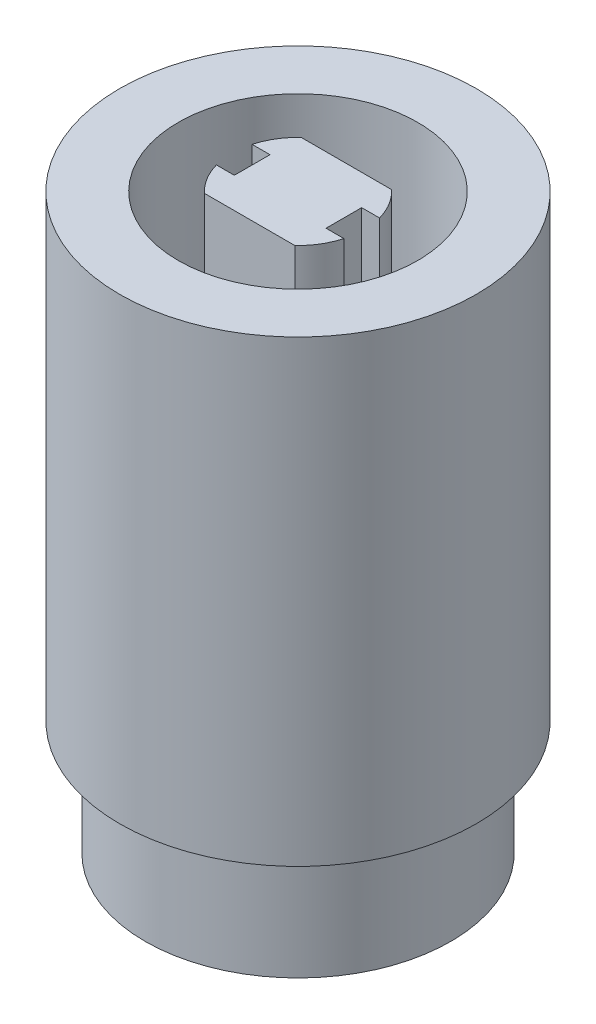
ISO-10303-21;
HEADER;
FILE_DESCRIPTION(('STEP AP214'),'2;1');
FILE_NAME('part.step','',(''),(''),'','','');
FILE_SCHEMA(('AUTOMOTIVE_DESIGN { 1 0 10303 214 1 1 1 1 }'));
ENDSEC;
DATA;
#1=APPLICATION_CONTEXT('core data for automotive mechanical design processes');
#2=APPLICATION_PROTOCOL_DEFINITION('international standard','automotive_design',2000,#1);
#3=PRODUCT_CONTEXT('',#1,'mechanical');
#4=PRODUCT('Part','Part','',(#3));
#5=PRODUCT_RELATED_PRODUCT_CATEGORY('part','',(#4));
#6=PRODUCT_DEFINITION_FORMATION('','',#4);
#7=PRODUCT_DEFINITION_CONTEXT('part definition',#1,'design');
#8=PRODUCT_DEFINITION('design','',#6,#7);
#9=PRODUCT_DEFINITION_SHAPE('','',#8);
#10=(LENGTH_UNIT() NAMED_UNIT(*) SI_UNIT(.MILLI.,.METRE.));
#11=(NAMED_UNIT(*) PLANE_ANGLE_UNIT() SI_UNIT($,.RADIAN.));
#12=(NAMED_UNIT(*) SI_UNIT($,.STERADIAN.) SOLID_ANGLE_UNIT());
#13=UNCERTAINTY_MEASURE_WITH_UNIT(LENGTH_MEASURE(1.E-05),#10,'distance_accuracy_value','');
#14=(GEOMETRIC_REPRESENTATION_CONTEXT(3) GLOBAL_UNCERTAINTY_ASSIGNED_CONTEXT((#13)) GLOBAL_UNIT_ASSIGNED_CONTEXT((#10,
#11,#12)) REPRESENTATION_CONTEXT('',''));
#15=CARTESIAN_POINT('',(0.,0.,0.));
#16=DIRECTION('',(0.,0.,1.));
#17=DIRECTION('',(1.,0.,0.));
#18=AXIS2_PLACEMENT_3D('',#15,#16,#17);
#19=CARTESIAN_POINT('',(0.,16.5,0.));
#20=DIRECTION('',(0.,-1.,0.));
#21=DIRECTION('',(0.,0.,-1.));
#22=AXIS2_PLACEMENT_3D('',#19,#20,#21);
#23=CYLINDRICAL_SURFACE('',#22,6.);
#24=CARTESIAN_POINT('',(0.,0.,0.));
#25=DIRECTION('',(0.,1.,0.));
#26=DIRECTION('',(0.,0.,1.));
#27=AXIS2_PLACEMENT_3D('',#24,#25,#26);
#28=CIRCLE('',#27,6.);
#29=CARTESIAN_POINT('',(0.,0.,6.));
#30=VERTEX_POINT('',#29);
#31=EDGE_CURVE('E215',#30,#30,#28,.T.);
#32=ORIENTED_EDGE('',*,*,#31,.T.);
#33=EDGE_LOOP('',(#32));
#34=FACE_BOUND('',#33,.T.);
#35=CARTESIAN_POINT('',(0.,4.5,0.));
#36=DIRECTION('',(0.,1.,0.));
#37=DIRECTION('',(0.,0.,1.));
#38=AXIS2_PLACEMENT_3D('',#35,#36,#37);
#39=CIRCLE('',#38,6.);
#40=CARTESIAN_POINT('',(0.,4.5,6.));
#41=VERTEX_POINT('',#40);
#42=EDGE_CURVE('E11',#41,#41,#39,.T.);
#43=ORIENTED_EDGE('',*,*,#42,.F.);
#44=EDGE_LOOP('',(#43));
#45=FACE_BOUND('',#44,.T.);
#46=ADVANCED_FACE('F35',(#34,#45),#23,.T.);
#47=CARTESIAN_POINT('',(0.,0.,0.));
#48=DIRECTION('',(0.,1.,0.));
#49=DIRECTION('',(0.,0.,1.));
#50=AXIS2_PLACEMENT_3D('',#47,#48,#49);
#51=PLANE('',#50);
#52=CARTESIAN_POINT('',(0.,0.,0.));
#53=DIRECTION('',(0.,-1.,0.));
#54=DIRECTION('',(0.,0.,-1.));
#55=AXIS2_PLACEMENT_3D('',#52,#53,#54);
#56=CIRCLE('',#55,4.2);
#57=CARTESIAN_POINT('',(0.,0.,-4.2));
#58=VERTEX_POINT('',#57);
#59=EDGE_CURVE('E204',#58,#58,#56,.T.);
#60=ORIENTED_EDGE('',*,*,#59,.F.);
#61=EDGE_LOOP('',(#60));
#62=FACE_BOUND('',#61,.T.);
#63=ORIENTED_EDGE('',*,*,#31,.F.);
#64=EDGE_LOOP('',(#63));
#65=FACE_BOUND('',#64,.T.);
#66=ADVANCED_FACE('F278',(#62,#65),#51,.F.);
#67=CARTESIAN_POINT('',(0.,14.5,0.));
#68=DIRECTION('',(0.,-1.,0.));
#69=DIRECTION('',(0.,0.,-1.));
#70=AXIS2_PLACEMENT_3D('',#67,#68,#69);
#71=CYLINDRICAL_SURFACE('',#70,4.2);
#72=CARTESIAN_POINT('',(1.4,10.,-3.95979797464467));
#73=CARTESIAN_POINT('',(1.4000003611268,10.0762554447705,-3.95979772342607));
#74=CARTESIAN_POINT('',(1.39374869715973,10.152508719753,-3.962024770072));
#75=CARTESIAN_POINT('',(1.36899158436433,10.3027561893919,-3.97064603713757));
#76=CARTESIAN_POINT('',(1.35048411703576,10.3767500098215,-3.97704094399064));
#77=CARTESIAN_POINT('',(1.30193767995887,10.5202776501962,-3.99319485164308));
#78=CARTESIAN_POINT('',(1.27192130996454,10.5898199012198,-4.00294725559851));
#79=CARTESIAN_POINT('',(1.20128627981793,10.7229040679671,-4.02470770814455));
#80=CARTESIAN_POINT('',(1.16066528040426,10.7864446555751,-4.03671625425057));
#81=CARTESIAN_POINT('',(1.06827160502003,10.9082079472736,-4.06216285170462));
#82=CARTESIAN_POINT('',(1.01615407792909,10.9661616001404,-4.07563652782502));
#83=CARTESIAN_POINT('',(0.902982734100153,11.0726895217145,-4.10219410721404));
#84=CARTESIAN_POINT('',(0.841927485073326,11.1212622842153,-4.11527794760546));
#85=CARTESIAN_POINT('',(0.710646311151014,11.2088704562614,-4.13999413690519));
#86=CARTESIAN_POINT('',(0.640222675714335,11.2476239588651,-4.15157970782248));
#87=CARTESIAN_POINT('',(0.493403712182463,11.3126282191785,-4.17157421479376));
#88=CARTESIAN_POINT('',(0.417009999962097,11.3388823464477,-4.17998400684202));
#89=CARTESIAN_POINT('',(0.263240344406891,11.3772301964853,-4.1924270560467));
#90=CARTESIAN_POINT('',(0.185991056794154,11.3897848247598,-4.19660240688585));
#91=CARTESIAN_POINT('',(0.0303770247537259,11.4018428107049,-4.20061051505545));
#92=CARTESIAN_POINT('',(-0.0479874269614512,11.4013495323134,-4.20044439168047));
#93=CARTESIAN_POINT('',(-0.200344921271345,11.3876180436076,-4.19588455466231));
#94=CARTESIAN_POINT('',(-0.274388868028335,11.3748804601357,-4.19165690657189));
#95=CARTESIAN_POINT('',(-0.419220814351026,11.3378498266274,-4.17965754275599));
#96=CARTESIAN_POINT('',(-0.490008592890846,11.3135559934283,-4.17188558683561));
#97=CARTESIAN_POINT('',(-0.627413464778819,11.2538101557714,-4.15345938410609));
#98=CARTESIAN_POINT('',(-0.693963509356598,11.2182156860345,-4.14276859533977));
#99=CARTESIAN_POINT('',(-0.820294055738037,11.1369964123723,-4.11961750254131));
#100=CARTESIAN_POINT('',(-0.880072668138678,11.0913688193427,-4.10715670680725));
#101=CARTESIAN_POINT('',(-0.994141213172669,10.988855849155,-4.08108668591246));
#102=CARTESIAN_POINT('',(-1.04804021989458,10.9315415790164,-4.06745101241733));
#103=CARTESIAN_POINT('',(-1.14558816343425,10.8085717839883,-4.04106269343156));
#104=CARTESIAN_POINT('',(-1.18923552058221,10.7429149760015,-4.0283101842403));
#105=CARTESIAN_POINT('',(-1.26558243705982,10.6038849241384,-4.00498735189743));
#106=CARTESIAN_POINT('',(-1.29811704911147,10.5304150160851,-3.9944507307435));
#107=CARTESIAN_POINT('',(-1.35022047061931,10.3786000480272,-3.97714311229618));
#108=CARTESIAN_POINT('',(-1.36979471405774,10.3002570462894,-3.97037053701712));
#109=CARTESIAN_POINT('',(-1.39462579492666,10.1447063024391,-3.96171490822898));
#110=CARTESIAN_POINT('',(-1.40048873370805,10.067606805356,-3.95962504441195));
#111=CARTESIAN_POINT('',(-1.39944761447625,9.91351339123615,-3.95999340887921));
#112=CARTESIAN_POINT('',(-1.39254587531816,9.83651945756533,-3.96245081109875));
#113=CARTESIAN_POINT('',(-1.36671591217256,9.68758024800437,-3.9714306532513));
#114=CARTESIAN_POINT('',(-1.34820895157278,9.61555239778911,-3.97781055616831));
#115=CARTESIAN_POINT('',(-1.30019940758483,9.47563895126486,-3.99375975139778));
#116=CARTESIAN_POINT('',(-1.27069487490884,9.40775409177284,-4.00332960908869));
#117=CARTESIAN_POINT('',(-1.20046407703446,9.27566741081428,-4.02495628634005));
#118=CARTESIAN_POINT('',(-1.15941156570188,9.2116507003015,-4.03708235931854));
#119=CARTESIAN_POINT('',(-1.0676198827806,9.09119552666277,-4.06232076223377));
#120=CARTESIAN_POINT('',(-1.0168778556983,9.03475930587429,-4.07543338221319));
#121=CARTESIAN_POINT('',(-0.904248388260451,8.92826082227311,-4.10193054092981));
#122=CARTESIAN_POINT('',(-0.841942178765312,8.87863585397361,-4.11529781009053));
#123=CARTESIAN_POINT('',(-0.70955820796036,8.79051740071274,-4.14017592258354));
#124=CARTESIAN_POINT('',(-0.639480722810373,8.7520235203726,-4.15168683184773));
#125=CARTESIAN_POINT('',(-0.493891807405213,8.6876118531936,-4.17150168134844));
#126=CARTESIAN_POINT('',(-0.418419572649675,8.66161221199271,-4.17982642006343));
#127=CARTESIAN_POINT('',(-0.263841852184423,8.62278116111585,-4.19242055172885));
#128=CARTESIAN_POINT('',(-0.184737688735445,8.6099449981673,-4.19669140847626));
#129=CARTESIAN_POINT('',(-0.0291414702040569,8.5982330913521,-4.20058608530759));
#130=CARTESIAN_POINT('',(0.0472986134880263,8.59872956449467,-4.20041888125215));
#131=CARTESIAN_POINT('',(0.198955603000244,8.61212023140497,-4.19597075127157));
#132=CARTESIAN_POINT('',(0.27417260754668,8.62501341941388,-4.19169015907006));
#133=CARTESIAN_POINT('',(0.420058967204883,8.66241512840635,-4.17957280936177));
#134=CARTESIAN_POINT('',(0.490781579277905,8.68673590149411,-4.17179361705608));
#135=CARTESIAN_POINT('',(0.627169691315714,8.74612854353602,-4.15348024986293));
#136=CARTESIAN_POINT('',(0.692834273799405,8.78120235727582,-4.14294557667223));
#137=CARTESIAN_POINT('',(0.819887622832299,8.86259731694281,-4.11972216359033));
#138=CARTESIAN_POINT('',(0.881028752180648,8.9092861595343,-4.10696821488697));
#139=CARTESIAN_POINT('',(0.994813436781397,9.01196034761867,-4.08090184308631));
#140=CARTESIAN_POINT('',(1.04745427027443,9.06794865916782,-4.06758924282336));
#141=CARTESIAN_POINT('',(1.14483853236637,9.19025309782173,-4.04128591755837));
#142=CARTESIAN_POINT('',(1.18919215239706,9.2568877153673,-4.02832819184083));
#143=CARTESIAN_POINT('',(1.26604008062156,9.39706819766389,-4.00484270652221));
#144=CARTESIAN_POINT('',(1.29853748754726,9.47061225024153,-3.99431431225749));
#145=CARTESIAN_POINT('',(1.34938135948583,9.61914655362188,-3.97741867889121));
#146=CARTESIAN_POINT('',(1.36830107280933,9.69392116893551,-3.97088486000055));
#147=CARTESIAN_POINT('',(1.39360804820897,9.84579847065338,-3.96207536955326));
#148=CARTESIAN_POINT('',(1.39999963487523,9.92290034437499,-3.95979822864446));
#149=CARTESIAN_POINT('',(1.4,10.,-3.95979797464467));
#150=B_SPLINE_CURVE_WITH_KNOTS('',3,(#72,#73,#74,#75,#76,#77,#78,#79,#80,#81,#82,#83,#84,#85,
#86,#87,#88,#89,#90,#91,#92,#93,#94,#95,#96,#97,#98,#99,#100,#101,#102,#103,#104,#105,#106,#107,
#108,#109,#110,#111,#112,#113,#114,#115,#116,#117,#118,#119,#120,#121,#122,#123,#124,#125,#126,
#127,#128,#129,#130,#131,#132,#133,#134,#135,#136,#137,#138,#139,#140,#141,#142,#143,#144,#145,
#146,#147,#148,#149),.UNSPECIFIED.,.T.,.F.,(4,2,2,2,2,2,2,2,2,2,2,2,2,2,2,2,2,2,2,2,2,2,2,2,2,2,
2,2,2,2,2,2,2,2,2,2,2,2,4),(0.,0.2284808187191,0.456999277021229,0.685071278501161,
0.913193632659619,1.14941872398595,1.38568171240783,1.6281090860112,1.87047106941505,
2.10440046270908,2.33826954623258,2.56296606755797,2.78767781864931,3.01534316804469,
3.24307188623631,3.48152244109484,3.72000971456948,3.96189695778806,4.20368271896043,
4.43456007906997,4.66539550168909,4.88830154073068,5.11124710802505,5.34126400826782,
5.5713487992376,5.81250331436311,6.05364926257327,6.29319307663974,6.53265036202601,
6.76085318545471,6.98903749610475,7.21359738453383,7.43819791065321,7.67109727325668,
7.90407106202465,8.14616463827384,8.38819489570395,8.61928497024548,8.8502952606343),.UNSPECIFIED.);
#151=CARTESIAN_POINT('',(1.4,10.,-3.95979797464467));
#152=VERTEX_POINT('',#151);
#153=EDGE_CURVE('E346',#152,#152,#150,.T.);
#154=ORIENTED_EDGE('',*,*,#153,.F.);
#155=EDGE_LOOP('',(#154));
#156=FACE_BOUND('',#155,.T.);
#157=CARTESIAN_POINT('',(0.,14.5,0.));
#158=DIRECTION('',(0.,-1.,0.));
#159=DIRECTION('',(0.,0.,-1.));
#160=AXIS2_PLACEMENT_3D('',#157,#158,#159);
#161=CIRCLE('',#160,4.2);
#162=CARTESIAN_POINT('',(0.,14.5,-4.2));
#163=VERTEX_POINT('',#162);
#164=EDGE_CURVE('E212',#163,#163,#161,.T.);
#165=ORIENTED_EDGE('',*,*,#164,.F.);
#166=EDGE_LOOP('',(#165));
#167=FACE_BOUND('',#166,.T.);
#168=ORIENTED_EDGE('',*,*,#59,.T.);
#169=EDGE_LOOP('',(#168));
#170=FACE_BOUND('',#169,.T.);
#171=ADVANCED_FACE('F283',(#156,#167,#170),#71,.F.);
#172=CARTESIAN_POINT('',(0.,14.5,0.));
#173=DIRECTION('',(0.,-1.,0.));
#174=DIRECTION('',(0.,0.,-1.));
#175=AXIS2_PLACEMENT_3D('',#172,#173,#174);
#176=PLANE('',#175);
#177=ORIENTED_EDGE('',*,*,#164,.T.);
#178=EDGE_LOOP('',(#177));
#179=FACE_BOUND('',#178,.T.);
#180=ADVANCED_FACE('F302',(#179),#176,.T.);
#181=CARTESIAN_POINT('',(0.,4.5,0.));
#182=DIRECTION('',(0.,1.,0.));
#183=DIRECTION('',(0.,0.,1.));
#184=AXIS2_PLACEMENT_3D('',#181,#182,#183);
#185=CYLINDRICAL_SURFACE('',#184,7.);
#186=CARTESIAN_POINT('',(1.4,10.,-6.8585712797929));
#187=CARTESIAN_POINT('',(1.39999712422486,10.0777901256867,-6.85857282635793));
#188=CARTESIAN_POINT('',(1.39349444040526,10.1556164726664,-6.85990911575777));
#189=CARTESIAN_POINT('',(1.36767719701612,10.3090675072006,-6.8651020382723));
#190=CARTESIAN_POINT('',(1.34835238589873,10.3846903824904,-6.86896068802811));
#191=CARTESIAN_POINT('',(1.29751409566761,10.5314922246958,-6.87874423210488));
#192=CARTESIAN_POINT('',(1.26601273981366,10.6026755301456,-6.88466707069477));
#193=CARTESIAN_POINT('',(1.19174875073872,10.7387447825758,-6.89790919272951));
#194=CARTESIAN_POINT('',(1.14898674604161,10.8036310807531,-6.90522839822853));
#195=CARTESIAN_POINT('',(1.05277070591481,10.9261854053954,-6.92055419571946));
#196=CARTESIAN_POINT('',(0.999187918278645,10.9837514230376,-6.92856832972143));
#197=CARTESIAN_POINT('',(0.883129504629835,11.0891405470106,-6.9443146122364));
#198=CARTESIAN_POINT('',(0.820653255769178,11.1369629703841,-6.95204674095165));
#199=CARTESIAN_POINT('',(0.687905898293958,11.2219032246798,-6.96643914984586));
#200=CARTESIAN_POINT('',(0.617571594741094,11.2589241193433,-6.97308950018171));
#201=CARTESIAN_POINT('',(0.471525810542179,11.3205849118674,-6.98448431637084));
#202=CARTESIAN_POINT('',(0.395814833988773,11.3452259686614,-6.98922896061767));
#203=CARTESIAN_POINT('',(0.242223482589891,11.3811100710675,-6.99622448963786));
#204=CARTESIAN_POINT('',(0.164384834900739,11.3925253685994,-6.99850740803378));
#205=CARTESIAN_POINT('',(0.00786599581255045,11.4021713325736,-7.00043289657045));
#206=CARTESIAN_POINT('',(-0.0708141137645805,11.4004032695041,-7.00007572113863));
#207=CARTESIAN_POINT('',(-0.225598801041024,11.3838633476982,-6.99678608815922));
#208=CARTESIAN_POINT('',(-0.301724100017858,11.369277031965,-6.99389037712174));
#209=CARTESIAN_POINT('',(-0.450424277212422,11.3278089545576,-6.98589048023172));
#210=CARTESIAN_POINT('',(-0.522999013245981,11.3009267009314,-6.98078620601655));
#211=CARTESIAN_POINT('',(-0.663067248481243,11.2354579437938,-6.96888214427942));
#212=CARTESIAN_POINT('',(-0.73052584378746,11.1967987484532,-6.96207187445313));
#213=CARTESIAN_POINT('',(-0.858067064203658,11.1089272918688,-6.94750657263299));
#214=CARTESIAN_POINT('',(-0.918148839335001,11.0597138163213,-6.93975143197311));
#215=CARTESIAN_POINT('',(-1.03033200347484,10.9511129290481,-6.92399350110244));
#216=CARTESIAN_POINT('',(-1.08227604320308,10.8915631385786,-6.91598875040523));
#217=CARTESIAN_POINT('',(-1.17546589044753,10.7645169805689,-6.90076200238265));
#218=CARTESIAN_POINT('',(-1.21671149561885,10.6970204627635,-6.89354001986367));
#219=CARTESIAN_POINT('',(-1.28738794072263,10.5557708354495,-6.88069266462093));
#220=CARTESIAN_POINT('',(-1.31679330688879,10.4820046453045,-6.87507074188969));
#221=CARTESIAN_POINT('',(-1.36274647827861,10.3304401467864,-6.86611066849782));
#222=CARTESIAN_POINT('',(-1.3792959592393,10.2526423653333,-6.86277222019799));
#223=CARTESIAN_POINT('',(-1.39883240845047,10.0966491988013,-6.85881670974959));
#224=CARTESIAN_POINT('',(-1.40204660245708,10.0184833959655,-6.85815405880016));
#225=CARTESIAN_POINT('',(-1.39543267963503,9.86273248752044,-6.85950279964396));
#226=CARTESIAN_POINT('',(-1.38560530237142,9.78514734923359,-6.86151403980543));
#227=CARTESIAN_POINT('',(-1.35338309130382,9.63352390359087,-6.86794125492881));
#228=CARTESIAN_POINT('',(-1.33110966917502,9.55945871974993,-6.87233398620296));
#229=CARTESIAN_POINT('',(-1.27475744943192,9.41611140935976,-6.88300885092331));
#230=CARTESIAN_POINT('',(-1.24067767932245,9.34682967738999,-6.88929114000778));
#231=CARTESIAN_POINT('',(-1.16116579910184,9.21402164606977,-6.90313968346855));
#232=CARTESIAN_POINT('',(-1.11559150917586,9.15058213517884,-6.91072160610865));
#233=CARTESIAN_POINT('',(-1.0145738010978,9.03216836319872,-6.92627213357291));
#234=CARTESIAN_POINT('',(-0.959129367202352,8.97719497445105,-6.93424077813345));
#235=CARTESIAN_POINT('',(-0.838925182897047,8.87641241714019,-6.94981484216902));
#236=CARTESIAN_POINT('',(-0.774035498501481,8.83075688349001,-6.95741280792157));
#237=CARTESIAN_POINT('',(-0.637375055288657,8.75099576590058,-6.97125978680068));
#238=CARTESIAN_POINT('',(-0.56560458560691,8.71688969691731,-6.97750885657295));
#239=CARTESIAN_POINT('',(-0.417623753153618,8.66141957955471,-6.98792211685494));
#240=CARTESIAN_POINT('',(-0.341441342869309,8.63998327448325,-6.99209810799646));
#241=CARTESIAN_POINT('',(-0.186465236551877,8.61023225327062,-6.99794530312724));
#242=CARTESIAN_POINT('',(-0.1076718561957,8.60191595673405,-6.99961680879781));
#243=CARTESIAN_POINT('',(0.048822051465073,8.59870222665196,-7.00025956635769));
#244=CARTESIAN_POINT('',(0.126517736998103,8.6035738073613,-6.99927729969091));
#245=CARTESIAN_POINT('',(0.279959443841898,8.62608753076694,-6.99482060984445));
#246=CARTESIAN_POINT('',(0.355705489655168,8.6437295128873,-6.99134621800093));
#247=CARTESIAN_POINT('',(0.502953849643134,8.6911805889283,-6.98229697711));
#248=CARTESIAN_POINT('',(0.574465420536392,8.72096192938366,-6.97672692147075));
#249=CARTESIAN_POINT('',(0.711509708260333,8.79181713786326,-6.96408610972738));
#250=CARTESIAN_POINT('',(0.777041952074376,8.8328918982652,-6.9570152350424));
#251=CARTESIAN_POINT('',(0.901409446148899,8.92594714188692,-6.94200638821005));
#252=CARTESIAN_POINT('',(0.960119602563101,8.97809287094149,-6.93405626790958));
#253=CARTESIAN_POINT('',(1.06803566485958,9.09147033613407,-6.91825712065112));
#254=CARTESIAN_POINT('',(1.11723931648381,9.1527042212562,-6.91040811808178));
#255=CARTESIAN_POINT('',(1.20524910723727,9.28331104338028,-6.89560679849795));
#256=CARTESIAN_POINT('',(1.24393754049564,9.35276454562464,-6.8886650508328));
#257=CARTESIAN_POINT('',(1.30903366900297,9.49730588261944,-6.87659332058801));
#258=CARTESIAN_POINT('',(1.33545250437114,9.57238853417659,-6.87146169553899));
#259=CARTESIAN_POINT('',(1.37013679579588,9.70636743761156,-6.86461553578883));
#260=CARTESIAN_POINT('',(1.38131545793185,9.76449958731726,-6.86236298876636));
#261=CARTESIAN_POINT('',(1.3962480251449,9.88174753637388,-6.8593402984653));
#262=CARTESIAN_POINT('',(1.40000218618809,9.94086330174295,-6.85857010408135));
#263=CARTESIAN_POINT('',(1.4,10.,-6.8585712797929));
#264=B_SPLINE_CURVE_WITH_KNOTS('',3,(#186,#187,#188,#189,#190,#191,#192,#193,#194,#195,#196,
#197,#198,#199,#200,#201,#202,#203,#204,#205,#206,#207,#208,#209,#210,#211,#212,#213,#214,#215,
#216,#217,#218,#219,#220,#221,#222,#223,#224,#225,#226,#227,#228,#229,#230,#231,#232,#233,#234,
#235,#236,#237,#238,#239,#240,#241,#242,#243,#244,#245,#246,#247,#248,#249,#250,#251,#252,#253,
#254,#255,#256,#257,#258,#259,#260,#261,#262,#263),.UNSPECIFIED.,.T.,.F.,(4,2,2,2,2,2,2,2,2,2,2,
2,2,2,2,2,2,2,2,2,2,2,2,2,2,2,2,2,2,2,2,2,2,2,2,2,2,2,4),(0.,0.2331538494172,0.466494334998015,
0.69960309711682,0.932698850803807,1.16875153567811,1.40482076049591,1.6429476061243,
1.88105215545184,2.11601948436313,2.35096416962748,2.58256305486952,2.8141712070325,
3.04723893911225,3.28033350078092,3.51749085467477,3.75465269371808,3.99232208441887,
4.22996049022434,4.46353260926431,4.6970914833979,4.92841078496646,5.15974914496158,
5.39410283684329,5.62848066018292,5.86645642426831,6.10442219282146,6.3410173901011,
6.57758408568279,6.8100342438056,7.04248147913459,7.27440023905632,7.50633732988558,
7.74201612835835,7.97775074445693,8.21602458010658,8.45408165124506,8.63133325091654,
8.80857873957901),.UNSPECIFIED.);
#265=CARTESIAN_POINT('',(1.4,10.,-6.8585712797929));
#266=VERTEX_POINT('',#265);
#267=EDGE_CURVE('E341',#266,#266,#264,.T.);
#268=ORIENTED_EDGE('',*,*,#267,.T.);
#269=EDGE_LOOP('',(#268));
#270=FACE_BOUND('',#269,.T.);
#271=CARTESIAN_POINT('',(0.,4.5,0.));
#272=DIRECTION('',(0.,1.,0.));
#273=DIRECTION('',(0.,0.,1.));
#274=AXIS2_PLACEMENT_3D('',#271,#272,#273);
#275=CIRCLE('',#274,7.);
#276=CARTESIAN_POINT('',(0.,4.5,7.));
#277=VERTEX_POINT('',#276);
#278=EDGE_CURVE('E220',#277,#277,#275,.T.);
#279=ORIENTED_EDGE('',*,*,#278,.T.);
#280=EDGE_LOOP('',(#279));
#281=FACE_BOUND('',#280,.T.);
#282=CARTESIAN_POINT('',(0.,22.5,0.));
#283=DIRECTION('',(0.,1.,0.));
#284=DIRECTION('',(0.,0.,1.));
#285=AXIS2_PLACEMENT_3D('',#282,#283,#284);
#286=CIRCLE('',#285,7.);
#287=CARTESIAN_POINT('',(0.,22.5,7.));
#288=VERTEX_POINT('',#287);
#289=EDGE_CURVE('E224',#288,#288,#286,.T.);
#290=ORIENTED_EDGE('',*,*,#289,.F.);
#291=EDGE_LOOP('',(#290));
#292=FACE_BOUND('',#291,.T.);
#293=ADVANCED_FACE('F293',(#270,#281,#292),#185,.T.);
#294=CARTESIAN_POINT('',(0.,4.5,0.));
#295=DIRECTION('',(0.,1.,0.));
#296=DIRECTION('',(0.,0.,1.));
#297=AXIS2_PLACEMENT_3D('',#294,#295,#296);
#298=PLANE('',#297);
#299=ORIENTED_EDGE('',*,*,#42,.T.);
#300=EDGE_LOOP('',(#299));
#301=FACE_BOUND('',#300,.T.);
#302=ORIENTED_EDGE('',*,*,#278,.F.);
#303=EDGE_LOOP('',(#302));
#304=FACE_BOUND('',#303,.T.);
#305=ADVANCED_FACE('F289',(#301,#304),#298,.F.);
#306=CARTESIAN_POINT('',(0.,4.5,0.));
#307=DIRECTION('',(0.,1.,0.));
#308=DIRECTION('',(0.,0.,1.));
#309=AXIS2_PLACEMENT_3D('',#306,#307,#308);
#310=CYLINDRICAL_SURFACE('',#309,4.7);
#311=CARTESIAN_POINT('',(0.,16.5,0.));
#312=DIRECTION('',(0.,1.,0.));
#313=DIRECTION('',(0.,0.,1.));
#314=AXIS2_PLACEMENT_3D('',#311,#312,#313);
#315=CIRCLE('',#314,4.7);
#316=CARTESIAN_POINT('',(0.,16.5,4.7));
#317=VERTEX_POINT('',#316);
#318=EDGE_CURVE('E165',#317,#317,#315,.T.);
#319=ORIENTED_EDGE('',*,*,#318,.F.);
#320=EDGE_LOOP('',(#319));
#321=FACE_BOUND('',#320,.T.);
#322=CARTESIAN_POINT('',(0.,22.5,0.));
#323=DIRECTION('',(0.,1.,0.));
#324=DIRECTION('',(0.,0.,1.));
#325=AXIS2_PLACEMENT_3D('',#322,#323,#324);
#326=CIRCLE('',#325,4.7);
#327=CARTESIAN_POINT('',(0.,22.5,4.7));
#328=VERTEX_POINT('',#327);
#329=EDGE_CURVE('E229',#328,#328,#326,.T.);
#330=ORIENTED_EDGE('',*,*,#329,.T.);
#331=EDGE_LOOP('',(#330));
#332=FACE_BOUND('',#331,.T.);
#333=ADVANCED_FACE('F292',(#321,#332),#310,.F.);
#334=CARTESIAN_POINT('',(0.,22.5,0.));
#335=DIRECTION('',(0.,1.,0.));
#336=DIRECTION('',(0.,0.,1.));
#337=AXIS2_PLACEMENT_3D('',#334,#335,#336);
#338=PLANE('',#337);
#339=ORIENTED_EDGE('',*,*,#289,.T.);
#340=EDGE_LOOP('',(#339));
#341=FACE_BOUND('',#340,.T.);
#342=ORIENTED_EDGE('',*,*,#329,.F.);
#343=EDGE_LOOP('',(#342));
#344=FACE_BOUND('',#343,.T.);
#345=ADVANCED_FACE('F299',(#341,#344),#338,.T.);
#346=CARTESIAN_POINT('',(0.,22.5,0.));
#347=DIRECTION('',(0.,1.,0.));
#348=DIRECTION('',(0.,0.,1.));
#349=AXIS2_PLACEMENT_3D('',#346,#347,#348);
#350=PLANE('',#349);
#351=DIRECTION('',(-1.,0.,0.));
#352=VECTOR('',#351,1.);
#353=CARTESIAN_POINT('',(-1.8,22.5,-0.7));
#354=LINE('',#353,#352);
#355=CARTESIAN_POINT('',(-1.8,22.5,-0.7));
#356=VERTEX_POINT('',#355);
#357=CARTESIAN_POINT('',(-2.50399680510978,22.5,-0.7));
#358=VERTEX_POINT('',#357);
#359=EDGE_CURVE('E144',#356,#358,#354,.T.);
#360=ORIENTED_EDGE('',*,*,#359,.F.);
#361=DIRECTION('',(0.,0.,-1.));
#362=VECTOR('',#361,1.);
#363=CARTESIAN_POINT('',(-1.8,22.5,0.7));
#364=LINE('',#363,#362);
#365=CARTESIAN_POINT('',(-1.8,22.5,0.7));
#366=VERTEX_POINT('',#365);
#367=EDGE_CURVE('E129',#366,#356,#364,.T.);
#368=ORIENTED_EDGE('',*,*,#367,.F.);
#369=DIRECTION('',(1.,0.,0.));
#370=VECTOR('',#369,1.);
#371=CARTESIAN_POINT('',(-1.8,22.5,0.7));
#372=LINE('',#371,#370);
#373=CARTESIAN_POINT('',(-2.50399680510978,22.5,0.7));
#374=VERTEX_POINT('',#373);
#375=EDGE_CURVE('E136',#374,#366,#372,.T.);
#376=ORIENTED_EDGE('',*,*,#375,.F.);
#377=CARTESIAN_POINT('',(0.,22.5,0.));
#378=DIRECTION('',(0.,1.,0.));
#379=DIRECTION('',(0.,0.,1.));
#380=AXIS2_PLACEMENT_3D('',#377,#378,#379);
#381=CIRCLE('',#380,2.6);
#382=CARTESIAN_POINT('',(-1.77482393492988,22.5,1.9));
#383=VERTEX_POINT('',#382);
#384=EDGE_CURVE('E190',#374,#383,#381,.T.);
#385=ORIENTED_EDGE('',*,*,#384,.T.);
#386=DIRECTION('',(-1.,0.,0.));
#387=VECTOR('',#386,1.);
#388=CARTESIAN_POINT('',(-1.77482393492988,22.5,1.9));
#389=LINE('',#388,#387);
#390=CARTESIAN_POINT('',(1.77482393492988,22.5,1.9));
#391=VERTEX_POINT('',#390);
#392=EDGE_CURVE('E156',#391,#383,#389,.T.);
#393=ORIENTED_EDGE('',*,*,#392,.F.);
#394=CARTESIAN_POINT('',(2.50399680510978,22.5,0.7));
#395=VERTEX_POINT('',#394);
#396=EDGE_CURVE('E201',#391,#395,#381,.T.);
#397=ORIENTED_EDGE('',*,*,#396,.T.);
#398=DIRECTION('',(1.,0.,0.));
#399=VECTOR('',#398,1.);
#400=CARTESIAN_POINT('',(2.50399680510978,22.5,0.7));
#401=LINE('',#400,#399);
#402=CARTESIAN_POINT('',(1.8,22.5,0.7));
#403=VERTEX_POINT('',#402);
#404=EDGE_CURVE('E164',#403,#395,#401,.T.);
#405=ORIENTED_EDGE('',*,*,#404,.F.);
#406=DIRECTION('',(0.,0.,1.));
#407=VECTOR('',#406,1.);
#408=CARTESIAN_POINT('',(1.8,22.5,0.7));
#409=LINE('',#408,#407);
#410=CARTESIAN_POINT('',(1.8,22.5,-0.7));
#411=VERTEX_POINT('',#410);
#412=EDGE_CURVE('E49',#411,#403,#409,.T.);
#413=ORIENTED_EDGE('',*,*,#412,.F.);
#414=DIRECTION('',(-1.,0.,0.));
#415=VECTOR('',#414,1.);
#416=CARTESIAN_POINT('',(2.50399680510978,22.5,-0.7));
#417=LINE('',#416,#415);
#418=CARTESIAN_POINT('',(2.50399680510978,22.5,-0.7));
#419=VERTEX_POINT('',#418);
#420=EDGE_CURVE('E167',#419,#411,#417,.T.);
#421=ORIENTED_EDGE('',*,*,#420,.F.);
#422=CARTESIAN_POINT('',(1.77482393492988,22.5,-1.9));
#423=VERTEX_POINT('',#422);
#424=EDGE_CURVE('E205',#419,#423,#381,.T.);
#425=ORIENTED_EDGE('',*,*,#424,.T.);
#426=DIRECTION('',(1.,0.,0.));
#427=VECTOR('',#426,1.);
#428=CARTESIAN_POINT('',(-1.77482393492988,22.5,-1.9));
#429=LINE('',#428,#427);
#430=CARTESIAN_POINT('',(-1.77482393492988,22.5,-1.9));
#431=VERTEX_POINT('',#430);
#432=EDGE_CURVE('E183',#431,#423,#429,.T.);
#433=ORIENTED_EDGE('',*,*,#432,.F.);
#434=EDGE_CURVE('E206',#431,#358,#381,.T.);
#435=ORIENTED_EDGE('',*,*,#434,.T.);
#436=EDGE_LOOP('',(#360,#368,#376,#385,#393,#397,#405,#413,#421,#425,#433,#435));
#437=FACE_BOUND('',#436,.T.);
#438=ADVANCED_FACE('F142',(#437),#350,.T.);
#439=CARTESIAN_POINT('',(2.50399680510978,14.8875484503403,0.7));
#440=DIRECTION('',(0.,0.,1.));
#441=DIRECTION('',(1.,0.,0.));
#442=AXIS2_PLACEMENT_3D('',#439,#440,#441);
#443=PLANE('',#442);
#444=DIRECTION('',(-1.,0.,0.));
#445=VECTOR('',#444,1.);
#446=CARTESIAN_POINT('',(2.50399680510978,16.5,0.7));
#447=LINE('',#446,#445);
#448=CARTESIAN_POINT('',(2.50399680510978,16.5,0.7));
#449=VERTEX_POINT('',#448);
#450=CARTESIAN_POINT('',(1.8,16.5,0.7));
#451=VERTEX_POINT('',#450);
#452=EDGE_CURVE('E140',#449,#451,#447,.T.);
#453=ORIENTED_EDGE('',*,*,#452,.T.);
#454=DIRECTION('',(0.,1.,0.));
#455=VECTOR('',#454,1.);
#456=CARTESIAN_POINT('',(1.8,14.8875484503403,0.7));
#457=LINE('',#456,#455);
#458=EDGE_CURVE('E170',#451,#403,#457,.T.);
#459=ORIENTED_EDGE('',*,*,#458,.T.);
#460=ORIENTED_EDGE('',*,*,#404,.T.);
#461=DIRECTION('',(0.,1.,0.));
#462=VECTOR('',#461,1.);
#463=CARTESIAN_POINT('',(2.50399680510978,14.8875484503403,0.7));
#464=LINE('',#463,#462);
#465=EDGE_CURVE('E174',#449,#395,#464,.T.);
#466=ORIENTED_EDGE('',*,*,#465,.F.);
#467=EDGE_LOOP('',(#453,#459,#460,#466));
#468=FACE_BOUND('',#467,.T.);
#469=ADVANCED_FACE('F315',(#468),#443,.F.);
#470=CARTESIAN_POINT('',(1.8,14.8875484503403,0.7));
#471=DIRECTION('',(-1.,0.,0.));
#472=DIRECTION('',(0.,0.,1.));
#473=AXIS2_PLACEMENT_3D('',#470,#471,#472);
#474=PLANE('',#473);
#475=DIRECTION('',(0.,0.,-1.));
#476=VECTOR('',#475,1.);
#477=CARTESIAN_POINT('',(1.8,16.5,0.7));
#478=LINE('',#477,#476);
#479=CARTESIAN_POINT('',(1.8,16.5,-0.7));
#480=VERTEX_POINT('',#479);
#481=EDGE_CURVE('E160',#451,#480,#478,.T.);
#482=ORIENTED_EDGE('',*,*,#481,.T.);
#483=DIRECTION('',(0.,1.,0.));
#484=VECTOR('',#483,1.);
#485=CARTESIAN_POINT('',(1.8,14.8875484503403,-0.7));
#486=LINE('',#485,#484);
#487=EDGE_CURVE('E161',#480,#411,#486,.T.);
#488=ORIENTED_EDGE('',*,*,#487,.T.);
#489=ORIENTED_EDGE('',*,*,#412,.T.);
#490=ORIENTED_EDGE('',*,*,#458,.F.);
#491=EDGE_LOOP('',(#482,#488,#489,#490));
#492=FACE_BOUND('',#491,.T.);
#493=ADVANCED_FACE('F313',(#492),#474,.F.);
#494=CARTESIAN_POINT('',(2.50399680510978,14.8875484503403,-0.7));
#495=DIRECTION('',(0.,0.,-1.));
#496=DIRECTION('',(-1.,0.,0.));
#497=AXIS2_PLACEMENT_3D('',#494,#495,#496);
#498=PLANE('',#497);
#499=DIRECTION('',(1.,0.,0.));
#500=VECTOR('',#499,1.);
#501=CARTESIAN_POINT('',(2.50399680510978,16.5,-0.7));
#502=LINE('',#501,#500);
#503=CARTESIAN_POINT('',(2.50399680510978,16.5,-0.7));
#504=VERTEX_POINT('',#503);
#505=EDGE_CURVE('E158',#480,#504,#502,.T.);
#506=ORIENTED_EDGE('',*,*,#505,.T.);
#507=DIRECTION('',(0.,1.,0.));
#508=VECTOR('',#507,1.);
#509=CARTESIAN_POINT('',(2.50399680510978,14.8875484503403,-0.7));
#510=LINE('',#509,#508);
#511=EDGE_CURVE('E172',#504,#419,#510,.T.);
#512=ORIENTED_EDGE('',*,*,#511,.T.);
#513=ORIENTED_EDGE('',*,*,#420,.T.);
#514=ORIENTED_EDGE('',*,*,#487,.F.);
#515=EDGE_LOOP('',(#506,#512,#513,#514));
#516=FACE_BOUND('',#515,.T.);
#517=ADVANCED_FACE('F273',(#516),#498,.F.);
#518=CARTESIAN_POINT('',(0.,22.5,0.));
#519=DIRECTION('',(0.,-1.,0.));
#520=DIRECTION('',(0.,0.,-1.));
#521=AXIS2_PLACEMENT_3D('',#518,#519,#520);
#522=CYLINDRICAL_SURFACE('',#521,2.6);
#523=ORIENTED_EDGE('',*,*,#424,.F.);
#524=ORIENTED_EDGE('',*,*,#511,.F.);
#525=CARTESIAN_POINT('',(0.,16.5,0.));
#526=DIRECTION('',(0.,1.,0.));
#527=DIRECTION('',(0.,0.,1.));
#528=AXIS2_PLACEMENT_3D('',#525,#526,#527);
#529=CIRCLE('',#528,2.6);
#530=CARTESIAN_POINT('',(1.77482393492988,16.5,-1.9));
#531=VERTEX_POINT('',#530);
#532=EDGE_CURVE('E209',#504,#531,#529,.T.);
#533=ORIENTED_EDGE('',*,*,#532,.T.);
#534=DIRECTION('',(0.,1.,0.));
#535=VECTOR('',#534,1.);
#536=CARTESIAN_POINT('',(1.77482393492988,16.5,-1.9));
#537=LINE('',#536,#535);
#538=EDGE_CURVE('E187',#531,#423,#537,.T.);
#539=ORIENTED_EDGE('',*,*,#538,.T.);
#540=EDGE_LOOP('',(#523,#524,#533,#539));
#541=FACE_BOUND('',#540,.T.);
#542=ADVANCED_FACE('F256',(#541),#522,.T.);
#543=CARTESIAN_POINT('',(-1.77482393492988,16.5,-1.9));
#544=DIRECTION('',(0.,0.,1.));
#545=DIRECTION('',(1.,0.,0.));
#546=AXIS2_PLACEMENT_3D('',#543,#544,#545);
#547=PLANE('',#546);
#548=ORIENTED_EDGE('',*,*,#432,.T.);
#549=ORIENTED_EDGE('',*,*,#538,.F.);
#550=DIRECTION('',(1.,0.,0.));
#551=VECTOR('',#550,1.);
#552=CARTESIAN_POINT('',(-1.77482393492988,16.5,-1.9));
#553=LINE('',#552,#551);
#554=CARTESIAN_POINT('',(-1.77482393492988,16.5,-1.9));
#555=VERTEX_POINT('',#554);
#556=EDGE_CURVE('E179',#555,#531,#553,.T.);
#557=ORIENTED_EDGE('',*,*,#556,.F.);
#558=DIRECTION('',(0.,1.,0.));
#559=VECTOR('',#558,1.);
#560=CARTESIAN_POINT('',(-1.77482393492988,16.5,-1.9));
#561=LINE('',#560,#559);
#562=EDGE_CURVE('E182',#555,#431,#561,.T.);
#563=ORIENTED_EDGE('',*,*,#562,.T.);
#564=EDGE_LOOP('',(#548,#549,#557,#563));
#565=FACE_BOUND('',#564,.T.);
#566=ADVANCED_FACE('F254',(#565),#547,.F.);
#567=CARTESIAN_POINT('',(-2.50399680510978,16.5,-0.7));
#568=VERTEX_POINT('',#567);
#569=EDGE_CURVE('E211',#555,#568,#529,.T.);
#570=ORIENTED_EDGE('',*,*,#569,.T.);
#571=DIRECTION('',(0.,1.,0.));
#572=VECTOR('',#571,1.);
#573=CARTESIAN_POINT('',(-2.50399680510978,14.8875484503403,-0.7));
#574=LINE('',#573,#572);
#575=EDGE_CURVE('E149',#568,#358,#574,.T.);
#576=ORIENTED_EDGE('',*,*,#575,.T.);
#577=ORIENTED_EDGE('',*,*,#434,.F.);
#578=ORIENTED_EDGE('',*,*,#562,.F.);
#579=EDGE_LOOP('',(#570,#576,#577,#578));
#580=FACE_BOUND('',#579,.T.);
#581=ADVANCED_FACE('F260',(#580),#522,.T.);
#582=CARTESIAN_POINT('',(-1.8,14.8875484503403,-0.7));
#583=DIRECTION('',(0.,0.,-1.));
#584=DIRECTION('',(-1.,0.,0.));
#585=AXIS2_PLACEMENT_3D('',#582,#583,#584);
#586=PLANE('',#585);
#587=DIRECTION('',(1.,0.,0.));
#588=VECTOR('',#587,1.);
#589=CARTESIAN_POINT('',(-1.8,16.5,-0.7));
#590=LINE('',#589,#588);
#591=CARTESIAN_POINT('',(-1.8,16.5,-0.7));
#592=VERTEX_POINT('',#591);
#593=EDGE_CURVE('E157',#568,#592,#590,.T.);
#594=ORIENTED_EDGE('',*,*,#593,.T.);
#595=DIRECTION('',(0.,1.,0.));
#596=VECTOR('',#595,1.);
#597=CARTESIAN_POINT('',(-1.8,14.8875484503403,-0.7));
#598=LINE('',#597,#596);
#599=EDGE_CURVE('E134',#592,#356,#598,.T.);
#600=ORIENTED_EDGE('',*,*,#599,.T.);
#601=ORIENTED_EDGE('',*,*,#359,.T.);
#602=ORIENTED_EDGE('',*,*,#575,.F.);
#603=EDGE_LOOP('',(#594,#600,#601,#602));
#604=FACE_BOUND('',#603,.T.);
#605=ADVANCED_FACE('F235',(#604),#586,.F.);
#606=CARTESIAN_POINT('',(-1.8,14.8875484503403,0.7));
#607=DIRECTION('',(1.,0.,0.));
#608=DIRECTION('',(0.,0.,-1.));
#609=AXIS2_PLACEMENT_3D('',#606,#607,#608);
#610=PLANE('',#609);
#611=DIRECTION('',(0.,0.,1.));
#612=VECTOR('',#611,1.);
#613=CARTESIAN_POINT('',(-1.8,16.5,0.7));
#614=LINE('',#613,#612);
#615=CARTESIAN_POINT('',(-1.8,16.5,0.7));
#616=VERTEX_POINT('',#615);
#617=EDGE_CURVE('E132',#592,#616,#614,.T.);
#618=ORIENTED_EDGE('',*,*,#617,.T.);
#619=DIRECTION('',(0.,1.,0.));
#620=VECTOR('',#619,1.);
#621=CARTESIAN_POINT('',(-1.8,14.8875484503403,0.7));
#622=LINE('',#621,#620);
#623=EDGE_CURVE('E125',#616,#366,#622,.T.);
#624=ORIENTED_EDGE('',*,*,#623,.T.);
#625=ORIENTED_EDGE('',*,*,#367,.T.);
#626=ORIENTED_EDGE('',*,*,#599,.F.);
#627=EDGE_LOOP('',(#618,#624,#625,#626));
#628=FACE_BOUND('',#627,.T.);
#629=ADVANCED_FACE('F126',(#628),#610,.F.);
#630=CARTESIAN_POINT('',(-1.8,14.8875484503403,0.7));
#631=DIRECTION('',(0.,0.,1.));
#632=DIRECTION('',(1.,0.,0.));
#633=AXIS2_PLACEMENT_3D('',#630,#631,#632);
#634=PLANE('',#633);
#635=DIRECTION('',(-1.,0.,0.));
#636=VECTOR('',#635,1.);
#637=CARTESIAN_POINT('',(-1.8,16.5,0.7));
#638=LINE('',#637,#636);
#639=CARTESIAN_POINT('',(-2.50399680510978,16.5,0.7));
#640=VERTEX_POINT('',#639);
#641=EDGE_CURVE('E154',#616,#640,#638,.T.);
#642=ORIENTED_EDGE('',*,*,#641,.T.);
#643=DIRECTION('',(0.,1.,0.));
#644=VECTOR('',#643,1.);
#645=CARTESIAN_POINT('',(-2.50399680510978,14.8875484503403,0.7));
#646=LINE('',#645,#644);
#647=EDGE_CURVE('E57',#640,#374,#646,.T.);
#648=ORIENTED_EDGE('',*,*,#647,.T.);
#649=ORIENTED_EDGE('',*,*,#375,.T.);
#650=ORIENTED_EDGE('',*,*,#623,.F.);
#651=EDGE_LOOP('',(#642,#648,#649,#650));
#652=FACE_BOUND('',#651,.T.);
#653=ADVANCED_FACE('F137',(#652),#634,.F.);
#654=ORIENTED_EDGE('',*,*,#384,.F.);
#655=ORIENTED_EDGE('',*,*,#647,.F.);
#656=CARTESIAN_POINT('',(-1.77482393492988,16.5,1.9));
#657=VERTEX_POINT('',#656);
#658=EDGE_CURVE('E210',#640,#657,#529,.T.);
#659=ORIENTED_EDGE('',*,*,#658,.T.);
#660=DIRECTION('',(0.,1.,0.));
#661=VECTOR('',#660,1.);
#662=CARTESIAN_POINT('',(-1.77482393492988,16.5,1.9));
#663=LINE('',#662,#661);
#664=EDGE_CURVE('E186',#657,#383,#663,.T.);
#665=ORIENTED_EDGE('',*,*,#664,.T.);
#666=EDGE_LOOP('',(#654,#655,#659,#665));
#667=FACE_BOUND('',#666,.T.);
#668=ADVANCED_FACE('F243',(#667),#522,.T.);
#669=CARTESIAN_POINT('',(-1.77482393492988,16.5,1.9));
#670=DIRECTION('',(0.,0.,-1.));
#671=DIRECTION('',(-1.,0.,0.));
#672=AXIS2_PLACEMENT_3D('',#669,#670,#671);
#673=PLANE('',#672);
#674=ORIENTED_EDGE('',*,*,#392,.T.);
#675=ORIENTED_EDGE('',*,*,#664,.F.);
#676=DIRECTION('',(-1.,0.,0.));
#677=VECTOR('',#676,1.);
#678=CARTESIAN_POINT('',(-1.77482393492988,16.5,1.9));
#679=LINE('',#678,#677);
#680=CARTESIAN_POINT('',(1.77482393492988,16.5,1.9));
#681=VERTEX_POINT('',#680);
#682=EDGE_CURVE('E192',#681,#657,#679,.T.);
#683=ORIENTED_EDGE('',*,*,#682,.F.);
#684=DIRECTION('',(0.,1.,0.));
#685=VECTOR('',#684,1.);
#686=CARTESIAN_POINT('',(1.77482393492988,16.5,1.9));
#687=LINE('',#686,#685);
#688=EDGE_CURVE('E195',#681,#391,#687,.T.);
#689=ORIENTED_EDGE('',*,*,#688,.T.);
#690=EDGE_LOOP('',(#674,#675,#683,#689));
#691=FACE_BOUND('',#690,.T.);
#692=ADVANCED_FACE('F275',(#691),#673,.F.);
#693=EDGE_CURVE('E42',#681,#449,#529,.T.);
#694=ORIENTED_EDGE('',*,*,#693,.T.);
#695=ORIENTED_EDGE('',*,*,#465,.T.);
#696=ORIENTED_EDGE('',*,*,#396,.F.);
#697=ORIENTED_EDGE('',*,*,#688,.F.);
#698=EDGE_LOOP('',(#694,#695,#696,#697));
#699=FACE_BOUND('',#698,.T.);
#700=ADVANCED_FACE('F263',(#699),#522,.T.);
#701=CARTESIAN_POINT('',(0.,16.5,0.));
#702=DIRECTION('',(0.,1.,0.));
#703=DIRECTION('',(0.,0.,1.));
#704=AXIS2_PLACEMENT_3D('',#701,#702,#703);
#705=PLANE('',#704);
#706=ORIENTED_EDGE('',*,*,#693,.F.);
#707=ORIENTED_EDGE('',*,*,#682,.T.);
#708=ORIENTED_EDGE('',*,*,#658,.F.);
#709=ORIENTED_EDGE('',*,*,#641,.F.);
#710=ORIENTED_EDGE('',*,*,#617,.F.);
#711=ORIENTED_EDGE('',*,*,#593,.F.);
#712=ORIENTED_EDGE('',*,*,#569,.F.);
#713=ORIENTED_EDGE('',*,*,#556,.T.);
#714=ORIENTED_EDGE('',*,*,#532,.F.);
#715=ORIENTED_EDGE('',*,*,#505,.F.);
#716=ORIENTED_EDGE('',*,*,#481,.F.);
#717=ORIENTED_EDGE('',*,*,#452,.F.);
#718=EDGE_LOOP('',(#706,#707,#708,#709,#710,#711,#712,#713,#714,#715,#716,#717));
#719=FACE_BOUND('',#718,.T.);
#720=ORIENTED_EDGE('',*,*,#318,.T.);
#721=EDGE_LOOP('',(#720));
#722=FACE_BOUND('',#721,.T.);
#723=ADVANCED_FACE('F240',(#719,#722),#705,.T.);
#724=CARTESIAN_POINT('',(0.,10.,-7.001));
#725=DIRECTION('',(0.,0.,1.));
#726=DIRECTION('',(1.,0.,0.));
#727=AXIS2_PLACEMENT_3D('',#724,#725,#726);
#728=CYLINDRICAL_SURFACE('',#727,1.4);
#729=ORIENTED_EDGE('',*,*,#267,.F.);
#730=EDGE_LOOP('',(#729));
#731=FACE_BOUND('',#730,.T.);
#732=ORIENTED_EDGE('',*,*,#153,.T.);
#733=EDGE_LOOP('',(#732));
#734=FACE_BOUND('',#733,.T.);
#735=ADVANCED_FACE('F332',(#731,#734),#728,.F.);
#736=CLOSED_SHELL('',(#46,#66,#171,#180,#293,#305,#333,#345,#438,#469,#493,#517,#542,#566,#581,
#605,#629,#653,#668,#692,#700,#723,#735));
#737=MANIFOLD_SOLID_BREP('B2',#736);
#738=ADVANCED_BREP_SHAPE_REPRESENTATION('',(#18,#737),#14);
#739=SHAPE_DEFINITION_REPRESENTATION(#9,#738);
ENDSEC;
END-ISO-10303-21;
